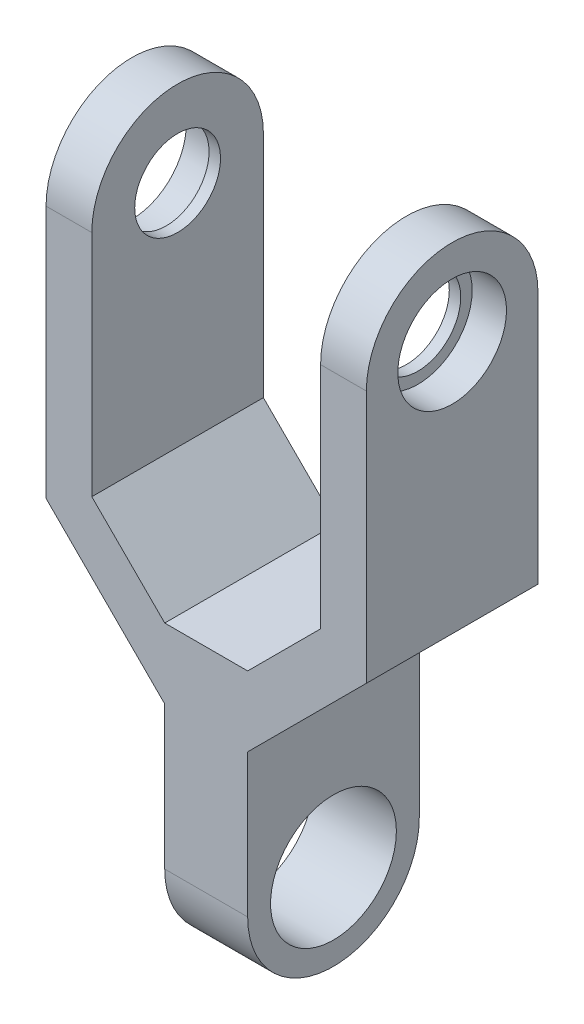
ISO-10303-21;
HEADER;
FILE_DESCRIPTION(('STEP AP214'),'2;1');
FILE_NAME('part.step','',(''),(''),'','','');
FILE_SCHEMA(('AUTOMOTIVE_DESIGN { 1 0 10303 214 1 1 1 1 }'));
ENDSEC;
DATA;
#1=APPLICATION_CONTEXT('core data for automotive mechanical design processes');
#2=APPLICATION_PROTOCOL_DEFINITION('international standard','automotive_design',2000,#1);
#3=PRODUCT_CONTEXT('',#1,'mechanical');
#4=PRODUCT('Part','Part','',(#3));
#5=PRODUCT_RELATED_PRODUCT_CATEGORY('part','',(#4));
#6=PRODUCT_DEFINITION_FORMATION('','',#4);
#7=PRODUCT_DEFINITION_CONTEXT('part definition',#1,'design');
#8=PRODUCT_DEFINITION('design','',#6,#7);
#9=PRODUCT_DEFINITION_SHAPE('','',#8);
#10=(LENGTH_UNIT() NAMED_UNIT(*) SI_UNIT(.MILLI.,.METRE.));
#11=(NAMED_UNIT(*) PLANE_ANGLE_UNIT() SI_UNIT($,.RADIAN.));
#12=(NAMED_UNIT(*) SI_UNIT($,.STERADIAN.) SOLID_ANGLE_UNIT());
#13=UNCERTAINTY_MEASURE_WITH_UNIT(LENGTH_MEASURE(1.E-05),#10,'distance_accuracy_value','');
#14=(GEOMETRIC_REPRESENTATION_CONTEXT(3) GLOBAL_UNCERTAINTY_ASSIGNED_CONTEXT((#13)) GLOBAL_UNIT_ASSIGNED_CONTEXT((#10,
#11,#12)) REPRESENTATION_CONTEXT('',''));
#15=CARTESIAN_POINT('',(0.,0.,0.));
#16=DIRECTION('',(0.,0.,1.));
#17=DIRECTION('',(1.,0.,0.));
#18=AXIS2_PLACEMENT_3D('',#15,#16,#17);
#19=CARTESIAN_POINT('',(41.25,90.,15.));
#20=DIRECTION('',(-1.,0.,0.));
#21=DIRECTION('',(0.,-1.,0.));
#22=AXIS2_PLACEMENT_3D('',#19,#20,#21);
#23=CYLINDRICAL_SURFACE('',#22,7.5);
#24=CARTESIAN_POINT('',(27.25,90.,15.));
#25=DIRECTION('',(1.,0.,0.));
#26=DIRECTION('',(0.,1.,0.));
#27=AXIS2_PLACEMENT_3D('',#24,#25,#26);
#28=CIRCLE('',#27,7.5);
#29=CARTESIAN_POINT('',(27.25,97.5,15.));
#30=VERTEX_POINT('',#29);
#31=EDGE_CURVE('E148',#30,#30,#28,.T.);
#32=ORIENTED_EDGE('',*,*,#31,.F.);
#33=EDGE_LOOP('',(#32));
#34=FACE_BOUND('',#33,.T.);
#35=CARTESIAN_POINT('',(29.25,90.,15.));
#36=DIRECTION('',(1.,0.,0.));
#37=DIRECTION('',(0.,0.,-1.));
#38=AXIS2_PLACEMENT_3D('',#35,#36,#37);
#39=CIRCLE('',#38,7.5);
#40=CARTESIAN_POINT('',(29.25,90.,7.5));
#41=VERTEX_POINT('',#40);
#42=EDGE_CURVE('E41',#41,#41,#39,.F.);
#43=ORIENTED_EDGE('',*,*,#42,.F.);
#44=EDGE_LOOP('',(#43));
#45=FACE_BOUND('',#44,.T.);
#46=ADVANCED_FACE('F37',(#34,#45),#23,.F.);
#47=CARTESIAN_POINT('',(-12.75,90.,15.));
#48=DIRECTION('',(-1.,0.,0.));
#49=DIRECTION('',(0.,0.,1.));
#50=AXIS2_PLACEMENT_3D('',#47,#48,#49);
#51=CIRCLE('',#50,7.5);
#52=CARTESIAN_POINT('',(-12.75,90.,22.5));
#53=VERTEX_POINT('',#52);
#54=EDGE_CURVE('E153',#53,#53,#51,.T.);
#55=ORIENTED_EDGE('',*,*,#54,.F.);
#56=EDGE_LOOP('',(#55));
#57=FACE_BOUND('',#56,.T.);
#58=CARTESIAN_POINT('',(-14.75,90.,15.));
#59=DIRECTION('',(-1.,0.,0.));
#60=DIRECTION('',(0.,-1.,0.));
#61=AXIS2_PLACEMENT_3D('',#58,#59,#60);
#62=CIRCLE('',#61,7.5);
#63=CARTESIAN_POINT('',(-14.75,82.5,15.));
#64=VERTEX_POINT('',#63);
#65=EDGE_CURVE('E243',#64,#64,#62,.F.);
#66=ORIENTED_EDGE('',*,*,#65,.F.);
#67=EDGE_LOOP('',(#66));
#68=FACE_BOUND('',#67,.T.);
#69=ADVANCED_FACE('F271',(#57,#68),#23,.F.);
#70=CARTESIAN_POINT('',(0.,25.,30.));
#71=DIRECTION('',(1.,0.,0.));
#72=DIRECTION('',(0.,1.,0.));
#73=AXIS2_PLACEMENT_3D('',#70,#71,#72);
#74=PLANE('',#73);
#75=CARTESIAN_POINT('',(0.,0.,15.));
#76=DIRECTION('',(1.,0.,0.));
#77=DIRECTION('',(0.,1.,0.));
#78=AXIS2_PLACEMENT_3D('',#75,#76,#77);
#79=CIRCLE('',#78,11.);
#80=CARTESIAN_POINT('',(0.,11.,15.));
#81=VERTEX_POINT('',#80);
#82=EDGE_CURVE('E164',#81,#81,#79,.T.);
#83=ORIENTED_EDGE('',*,*,#82,.T.);
#84=EDGE_LOOP('',(#83));
#85=FACE_BOUND('',#84,.T.);
#86=DIRECTION('',(0.,-1.,0.));
#87=VECTOR('',#86,1.);
#88=CARTESIAN_POINT('',(0.,25.,0.));
#89=LINE('',#88,#87);
#90=CARTESIAN_POINT('',(0.,25.,0.));
#91=VERTEX_POINT('',#90);
#92=CARTESIAN_POINT('',(0.,0.,0.));
#93=VERTEX_POINT('',#92);
#94=EDGE_CURVE('E192',#91,#93,#89,.T.);
#95=ORIENTED_EDGE('',*,*,#94,.T.);
#96=CARTESIAN_POINT('',(0.,0.,15.));
#97=DIRECTION('',(1.,0.,0.));
#98=DIRECTION('',(0.,1.,0.));
#99=AXIS2_PLACEMENT_3D('',#96,#97,#98);
#100=CIRCLE('',#99,15.);
#101=CARTESIAN_POINT('',(0.,0.,30.));
#102=VERTEX_POINT('',#101);
#103=EDGE_CURVE('E168',#93,#102,#100,.F.);
#104=ORIENTED_EDGE('',*,*,#103,.T.);
#105=DIRECTION('',(0.,-1.,0.));
#106=VECTOR('',#105,1.);
#107=CARTESIAN_POINT('',(0.,25.,30.));
#108=LINE('',#107,#106);
#109=CARTESIAN_POINT('',(0.,25.,30.));
#110=VERTEX_POINT('',#109);
#111=EDGE_CURVE('E99',#110,#102,#108,.T.);
#112=ORIENTED_EDGE('',*,*,#111,.F.);
#113=DIRECTION('',(0.,0.,-1.));
#114=VECTOR('',#113,1.);
#115=CARTESIAN_POINT('',(0.,25.,30.));
#116=LINE('',#115,#114);
#117=EDGE_CURVE('E210',#110,#91,#116,.T.);
#118=ORIENTED_EDGE('',*,*,#117,.T.);
#119=EDGE_LOOP('',(#95,#104,#112,#118));
#120=FACE_BOUND('',#119,.T.);
#121=ADVANCED_FACE('F39',(#85,#120),#74,.F.);
#122=CARTESIAN_POINT('',(14.5,0.,30.));
#123=DIRECTION('',(-1.,0.,0.));
#124=DIRECTION('',(0.,-1.,0.));
#125=AXIS2_PLACEMENT_3D('',#122,#123,#124);
#126=PLANE('',#125);
#127=CARTESIAN_POINT('',(14.5,0.,15.));
#128=DIRECTION('',(1.,0.,0.));
#129=DIRECTION('',(0.,0.,-1.));
#130=AXIS2_PLACEMENT_3D('',#127,#128,#129);
#131=CIRCLE('',#130,11.);
#132=CARTESIAN_POINT('',(14.5,0.,4.));
#133=VERTEX_POINT('',#132);
#134=EDGE_CURVE('E159',#133,#133,#131,.T.);
#135=ORIENTED_EDGE('',*,*,#134,.F.);
#136=EDGE_LOOP('',(#135));
#137=FACE_BOUND('',#136,.T.);
#138=DIRECTION('',(0.,1.,0.));
#139=VECTOR('',#138,1.);
#140=CARTESIAN_POINT('',(14.5,0.,0.));
#141=LINE('',#140,#139);
#142=CARTESIAN_POINT('',(14.5,0.,0.));
#143=VERTEX_POINT('',#142);
#144=CARTESIAN_POINT('',(14.5,25.,0.));
#145=VERTEX_POINT('',#144);
#146=EDGE_CURVE('E216',#143,#145,#141,.T.);
#147=ORIENTED_EDGE('',*,*,#146,.T.);
#148=DIRECTION('',(0.,0.,-1.));
#149=VECTOR('',#148,1.);
#150=CARTESIAN_POINT('',(14.5,25.,30.));
#151=LINE('',#150,#149);
#152=CARTESIAN_POINT('',(14.5,25.,30.));
#153=VERTEX_POINT('',#152);
#154=EDGE_CURVE('E11',#153,#145,#151,.T.);
#155=ORIENTED_EDGE('',*,*,#154,.F.);
#156=DIRECTION('',(0.,1.,0.));
#157=VECTOR('',#156,1.);
#158=CARTESIAN_POINT('',(14.5,0.,30.));
#159=LINE('',#158,#157);
#160=CARTESIAN_POINT('',(14.5,0.,30.));
#161=VERTEX_POINT('',#160);
#162=EDGE_CURVE('E197',#161,#153,#159,.T.);
#163=ORIENTED_EDGE('',*,*,#162,.F.);
#164=CARTESIAN_POINT('',(14.5,0.,15.));
#165=DIRECTION('',(1.,0.,0.));
#166=DIRECTION('',(0.,0.,-1.));
#167=AXIS2_PLACEMENT_3D('',#164,#165,#166);
#168=CIRCLE('',#167,15.);
#169=EDGE_CURVE('E167',#161,#143,#168,.T.);
#170=ORIENTED_EDGE('',*,*,#169,.T.);
#171=EDGE_LOOP('',(#147,#155,#163,#170));
#172=FACE_BOUND('',#171,.T.);
#173=ADVANCED_FACE('F335',(#137,#172),#126,.F.);
#174=CARTESIAN_POINT('',(14.5,25.,30.));
#175=DIRECTION('',(-0.707106781186546,0.707106781186549,0.));
#176=DIRECTION('',(-0.707106781186549,-0.707106781186546,0.));
#177=AXIS2_PLACEMENT_3D('',#174,#175,#176);
#178=PLANE('',#177);
#179=DIRECTION('',(0.707106781186549,0.707106781186546,0.));
#180=VECTOR('',#179,1.);
#181=CARTESIAN_POINT('',(14.5,25.,0.));
#182=LINE('',#181,#180);
#183=CARTESIAN_POINT('',(35.25,45.7499999999999,0.));
#184=VERTEX_POINT('',#183);
#185=EDGE_CURVE('E218',#145,#184,#182,.T.);
#186=ORIENTED_EDGE('',*,*,#185,.T.);
#187=DIRECTION('',(0.,0.,-1.));
#188=VECTOR('',#187,1.);
#189=CARTESIAN_POINT('',(35.25,45.7499999999999,30.));
#190=LINE('',#189,#188);
#191=CARTESIAN_POINT('',(35.25,45.7499999999999,30.));
#192=VERTEX_POINT('',#191);
#193=EDGE_CURVE('E46',#192,#184,#190,.T.);
#194=ORIENTED_EDGE('',*,*,#193,.F.);
#195=DIRECTION('',(0.707106781186549,0.707106781186546,0.));
#196=VECTOR('',#195,1.);
#197=CARTESIAN_POINT('',(14.5,25.,30.));
#198=LINE('',#197,#196);
#199=EDGE_CURVE('E199',#153,#192,#198,.T.);
#200=ORIENTED_EDGE('',*,*,#199,.F.);
#201=ORIENTED_EDGE('',*,*,#154,.T.);
#202=EDGE_LOOP('',(#186,#194,#200,#201));
#203=FACE_BOUND('',#202,.T.);
#204=ADVANCED_FACE('F332',(#203),#178,.F.);
#205=CARTESIAN_POINT('',(35.25,45.7499999999999,30.));
#206=DIRECTION('',(-1.,0.,0.));
#207=DIRECTION('',(0.,0.,1.));
#208=AXIS2_PLACEMENT_3D('',#205,#206,#207);
#209=PLANE('',#208);
#210=CARTESIAN_POINT('',(35.25,90.,15.));
#211=DIRECTION('',(1.,0.,0.));
#212=DIRECTION('',(0.,0.,-1.));
#213=AXIS2_PLACEMENT_3D('',#210,#211,#212);
#214=CIRCLE('',#213,9.49999999999999);
#215=CARTESIAN_POINT('',(35.25,90.,5.50000000000001));
#216=VERTEX_POINT('',#215);
#217=EDGE_CURVE('E258',#216,#216,#214,.T.);
#218=ORIENTED_EDGE('',*,*,#217,.F.);
#219=EDGE_LOOP('',(#218));
#220=FACE_BOUND('',#219,.T.);
#221=DIRECTION('',(0.,1.,0.));
#222=VECTOR('',#221,1.);
#223=CARTESIAN_POINT('',(35.25,45.7499999999999,0.));
#224=LINE('',#223,#222);
#225=CARTESIAN_POINT('',(35.25,90.,0.));
#226=VERTEX_POINT('',#225);
#227=EDGE_CURVE('E220',#184,#226,#224,.T.);
#228=ORIENTED_EDGE('',*,*,#227,.T.);
#229=CARTESIAN_POINT('',(35.25,90.,15.));
#230=DIRECTION('',(1.,0.,0.));
#231=DIRECTION('',(0.,0.,1.));
#232=AXIS2_PLACEMENT_3D('',#229,#230,#231);
#233=CIRCLE('',#232,15.);
#234=CARTESIAN_POINT('',(35.25,90.,30.));
#235=VERTEX_POINT('',#234);
#236=EDGE_CURVE('E150',#226,#235,#233,.T.);
#237=ORIENTED_EDGE('',*,*,#236,.T.);
#238=DIRECTION('',(0.,1.,0.));
#239=VECTOR('',#238,1.);
#240=CARTESIAN_POINT('',(35.25,45.7499999999999,30.));
#241=LINE('',#240,#239);
#242=EDGE_CURVE('E201',#192,#235,#241,.T.);
#243=ORIENTED_EDGE('',*,*,#242,.F.);
#244=ORIENTED_EDGE('',*,*,#193,.T.);
#245=EDGE_LOOP('',(#228,#237,#243,#244));
#246=FACE_BOUND('',#245,.T.);
#247=ADVANCED_FACE('F328',(#220,#246),#209,.F.);
#248=CARTESIAN_POINT('',(27.25,90.,30.));
#249=DIRECTION('',(1.,0.,0.));
#250=DIRECTION('',(0.,1.,0.));
#251=AXIS2_PLACEMENT_3D('',#248,#249,#250);
#252=PLANE('',#251);
#253=ORIENTED_EDGE('',*,*,#31,.T.);
#254=EDGE_LOOP('',(#253));
#255=FACE_BOUND('',#254,.T.);
#256=DIRECTION('',(0.,-1.,0.));
#257=VECTOR('',#256,1.);
#258=CARTESIAN_POINT('',(27.25,90.,0.));
#259=LINE('',#258,#257);
#260=CARTESIAN_POINT('',(27.25,90.,0.));
#261=VERTEX_POINT('',#260);
#262=CARTESIAN_POINT('',(27.25,50.,0.));
#263=VERTEX_POINT('',#262);
#264=EDGE_CURVE('E225',#261,#263,#259,.T.);
#265=ORIENTED_EDGE('',*,*,#264,.T.);
#266=DIRECTION('',(0.,0.,-1.));
#267=VECTOR('',#266,1.);
#268=CARTESIAN_POINT('',(27.25,50.,30.));
#269=LINE('',#268,#267);
#270=CARTESIAN_POINT('',(27.25,50.,30.));
#271=VERTEX_POINT('',#270);
#272=EDGE_CURVE('E239',#271,#263,#269,.T.);
#273=ORIENTED_EDGE('',*,*,#272,.F.);
#274=DIRECTION('',(0.,-1.,0.));
#275=VECTOR('',#274,1.);
#276=CARTESIAN_POINT('',(27.25,90.,30.));
#277=LINE('',#276,#275);
#278=CARTESIAN_POINT('',(27.25,90.,30.));
#279=VERTEX_POINT('',#278);
#280=EDGE_CURVE('E205',#279,#271,#277,.T.);
#281=ORIENTED_EDGE('',*,*,#280,.F.);
#282=CARTESIAN_POINT('',(27.25,90.,15.));
#283=DIRECTION('',(1.,0.,0.));
#284=DIRECTION('',(0.,1.,0.));
#285=AXIS2_PLACEMENT_3D('',#282,#283,#284);
#286=CIRCLE('',#285,15.);
#287=EDGE_CURVE('E156',#279,#261,#286,.F.);
#288=ORIENTED_EDGE('',*,*,#287,.T.);
#289=EDGE_LOOP('',(#265,#273,#281,#288));
#290=FACE_BOUND('',#289,.T.);
#291=ADVANCED_FACE('F324',(#255,#290),#252,.F.);
#292=CARTESIAN_POINT('',(-12.75,50.,30.));
#293=DIRECTION('',(-1.,0.,0.));
#294=DIRECTION('',(0.,0.,1.));
#295=AXIS2_PLACEMENT_3D('',#292,#293,#294);
#296=PLANE('',#295);
#297=ORIENTED_EDGE('',*,*,#54,.T.);
#298=EDGE_LOOP('',(#297));
#299=FACE_BOUND('',#298,.T.);
#300=DIRECTION('',(0.,1.,0.));
#301=VECTOR('',#300,1.);
#302=CARTESIAN_POINT('',(-12.75,50.,0.));
#303=LINE('',#302,#301);
#304=CARTESIAN_POINT('',(-12.75,50.,0.));
#305=VERTEX_POINT('',#304);
#306=CARTESIAN_POINT('',(-12.75,90.,0.));
#307=VERTEX_POINT('',#306);
#308=EDGE_CURVE('E228',#305,#307,#303,.T.);
#309=ORIENTED_EDGE('',*,*,#308,.T.);
#310=CARTESIAN_POINT('',(-12.75,90.,15.));
#311=DIRECTION('',(-1.,0.,0.));
#312=DIRECTION('',(0.,0.,1.));
#313=AXIS2_PLACEMENT_3D('',#310,#311,#312);
#314=CIRCLE('',#313,15.);
#315=CARTESIAN_POINT('',(-12.75,90.,30.));
#316=VERTEX_POINT('',#315);
#317=EDGE_CURVE('E147',#307,#316,#314,.F.);
#318=ORIENTED_EDGE('',*,*,#317,.T.);
#319=DIRECTION('',(0.,1.,0.));
#320=VECTOR('',#319,1.);
#321=CARTESIAN_POINT('',(-12.75,50.,30.));
#322=LINE('',#321,#320);
#323=CARTESIAN_POINT('',(-12.75,50.,30.));
#324=VERTEX_POINT('',#323);
#325=EDGE_CURVE('E130',#324,#316,#322,.T.);
#326=ORIENTED_EDGE('',*,*,#325,.F.);
#327=DIRECTION('',(0.,0.,-1.));
#328=VECTOR('',#327,1.);
#329=CARTESIAN_POINT('',(-12.75,50.,30.));
#330=LINE('',#329,#328);
#331=EDGE_CURVE('E236',#324,#305,#330,.T.);
#332=ORIENTED_EDGE('',*,*,#331,.T.);
#333=EDGE_LOOP('',(#309,#318,#326,#332));
#334=FACE_BOUND('',#333,.T.);
#335=ADVANCED_FACE('F320',(#299,#334),#296,.F.);
#336=CARTESIAN_POINT('',(-20.75,90.,30.));
#337=DIRECTION('',(1.,0.,0.));
#338=DIRECTION('',(0.,1.,0.));
#339=AXIS2_PLACEMENT_3D('',#336,#337,#338);
#340=PLANE('',#339);
#341=CARTESIAN_POINT('',(-20.75,90.,15.));
#342=DIRECTION('',(-1.,0.,0.));
#343=DIRECTION('',(0.,-1.,0.));
#344=AXIS2_PLACEMENT_3D('',#341,#342,#343);
#345=CIRCLE('',#344,9.49999999999999);
#346=CARTESIAN_POINT('',(-20.75,80.5,15.));
#347=VERTEX_POINT('',#346);
#348=EDGE_CURVE('E251',#347,#347,#345,.T.);
#349=ORIENTED_EDGE('',*,*,#348,.F.);
#350=EDGE_LOOP('',(#349));
#351=FACE_BOUND('',#350,.T.);
#352=DIRECTION('',(0.,-1.,0.));
#353=VECTOR('',#352,1.);
#354=CARTESIAN_POINT('',(-20.75,90.,0.));
#355=LINE('',#354,#353);
#356=CARTESIAN_POINT('',(-20.75,90.,0.));
#357=VERTEX_POINT('',#356);
#358=CARTESIAN_POINT('',(-20.75,45.7500000000002,0.));
#359=VERTEX_POINT('',#358);
#360=EDGE_CURVE('E231',#357,#359,#355,.T.);
#361=ORIENTED_EDGE('',*,*,#360,.T.);
#362=DIRECTION('',(0.,0.,-1.));
#363=VECTOR('',#362,1.);
#364=CARTESIAN_POINT('',(-20.75,45.7500000000002,30.));
#365=LINE('',#364,#363);
#366=CARTESIAN_POINT('',(-20.75,45.7500000000002,30.));
#367=VERTEX_POINT('',#366);
#368=EDGE_CURVE('E141',#367,#359,#365,.T.);
#369=ORIENTED_EDGE('',*,*,#368,.F.);
#370=DIRECTION('',(0.,-1.,0.));
#371=VECTOR('',#370,1.);
#372=CARTESIAN_POINT('',(-20.75,90.,30.));
#373=LINE('',#372,#371);
#374=CARTESIAN_POINT('',(-20.75,90.,30.));
#375=VERTEX_POINT('',#374);
#376=EDGE_CURVE('E126',#375,#367,#373,.T.);
#377=ORIENTED_EDGE('',*,*,#376,.F.);
#378=CARTESIAN_POINT('',(-20.75,90.,15.));
#379=DIRECTION('',(-1.,0.,0.));
#380=DIRECTION('',(0.,1.,0.));
#381=AXIS2_PLACEMENT_3D('',#378,#379,#380);
#382=CIRCLE('',#381,15.);
#383=EDGE_CURVE('E140',#375,#357,#382,.T.);
#384=ORIENTED_EDGE('',*,*,#383,.T.);
#385=EDGE_LOOP('',(#361,#369,#377,#384));
#386=FACE_BOUND('',#385,.T.);
#387=ADVANCED_FACE('F138',(#351,#386),#340,.F.);
#388=CARTESIAN_POINT('',(0.,25.,30.));
#389=DIRECTION('',(0.707106781186551,0.707106781186544,0.));
#390=DIRECTION('',(-0.707106781186544,0.707106781186551,0.));
#391=AXIS2_PLACEMENT_3D('',#388,#389,#390);
#392=PLANE('',#391);
#393=DIRECTION('',(0.707106781186544,-0.707106781186551,0.));
#394=VECTOR('',#393,1.);
#395=CARTESIAN_POINT('',(0.,25.,0.));
#396=LINE('',#395,#394);
#397=EDGE_CURVE('E93',#359,#91,#396,.T.);
#398=ORIENTED_EDGE('',*,*,#397,.T.);
#399=ORIENTED_EDGE('',*,*,#117,.F.);
#400=DIRECTION('',(0.707106781186544,-0.707106781186551,0.));
#401=VECTOR('',#400,1.);
#402=CARTESIAN_POINT('',(0.,25.,30.));
#403=LINE('',#402,#401);
#404=EDGE_CURVE('E63',#367,#110,#403,.T.);
#405=ORIENTED_EDGE('',*,*,#404,.F.);
#406=ORIENTED_EDGE('',*,*,#368,.T.);
#407=EDGE_LOOP('',(#398,#399,#405,#406));
#408=FACE_BOUND('',#407,.T.);
#409=ADVANCED_FACE('F312',(#408),#392,.F.);
#410=CARTESIAN_POINT('',(0.,0.,30.));
#411=DIRECTION('',(0.,0.,1.));
#412=DIRECTION('',(1.,0.,0.));
#413=AXIS2_PLACEMENT_3D('',#410,#411,#412);
#414=PLANE('',#413);
#415=DIRECTION('',(0.707106781186547,0.707106781186547,0.));
#416=VECTOR('',#415,1.);
#417=CARTESIAN_POINT('',(14.5,37.25,30.));
#418=LINE('',#417,#416);
#419=CARTESIAN_POINT('',(14.5,37.25,30.));
#420=VERTEX_POINT('',#419);
#421=EDGE_CURVE('E176',#420,#271,#418,.T.);
#422=ORIENTED_EDGE('',*,*,#421,.F.);
#423=DIRECTION('',(1.,0.,0.));
#424=VECTOR('',#423,1.);
#425=CARTESIAN_POINT('',(0.,37.25,30.));
#426=LINE('',#425,#424);
#427=CARTESIAN_POINT('',(0.,37.25,30.));
#428=VERTEX_POINT('',#427);
#429=EDGE_CURVE('E184',#428,#420,#426,.T.);
#430=ORIENTED_EDGE('',*,*,#429,.F.);
#431=DIRECTION('',(0.707106781186547,-0.707106781186548,0.));
#432=VECTOR('',#431,1.);
#433=CARTESIAN_POINT('',(-12.75,50.,30.));
#434=LINE('',#433,#432);
#435=EDGE_CURVE('E170',#324,#428,#434,.T.);
#436=ORIENTED_EDGE('',*,*,#435,.F.);
#437=ORIENTED_EDGE('',*,*,#325,.T.);
#438=DIRECTION('',(-1.,0.,0.));
#439=VECTOR('',#438,1.);
#440=CARTESIAN_POINT('',(-12.75,90.,30.));
#441=LINE('',#440,#439);
#442=EDGE_CURVE('E122',#316,#375,#441,.T.);
#443=ORIENTED_EDGE('',*,*,#442,.T.);
#444=ORIENTED_EDGE('',*,*,#376,.T.);
#445=ORIENTED_EDGE('',*,*,#404,.T.);
#446=ORIENTED_EDGE('',*,*,#111,.T.);
#447=DIRECTION('',(1.,0.,0.));
#448=VECTOR('',#447,1.);
#449=CARTESIAN_POINT('',(0.,0.,30.));
#450=LINE('',#449,#448);
#451=EDGE_CURVE('E195',#102,#161,#450,.T.);
#452=ORIENTED_EDGE('',*,*,#451,.T.);
#453=ORIENTED_EDGE('',*,*,#162,.T.);
#454=ORIENTED_EDGE('',*,*,#199,.T.);
#455=ORIENTED_EDGE('',*,*,#242,.T.);
#456=DIRECTION('',(-1.,0.,0.));
#457=VECTOR('',#456,1.);
#458=CARTESIAN_POINT('',(35.25,90.,30.));
#459=LINE('',#458,#457);
#460=EDGE_CURVE('E203',#235,#279,#459,.T.);
#461=ORIENTED_EDGE('',*,*,#460,.T.);
#462=ORIENTED_EDGE('',*,*,#280,.T.);
#463=EDGE_LOOP('',(#422,#430,#436,#437,#443,#444,#445,#446,#452,#453,#454,#455,#461,#462));
#464=FACE_BOUND('',#463,.T.);
#465=ADVANCED_FACE('F125',(#464),#414,.T.);
#466=CARTESIAN_POINT('',(0.,0.,0.));
#467=DIRECTION('',(0.,0.,1.));
#468=DIRECTION('',(1.,0.,0.));
#469=AXIS2_PLACEMENT_3D('',#466,#467,#468);
#470=PLANE('',#469);
#471=DIRECTION('',(1.,0.,0.));
#472=VECTOR('',#471,1.);
#473=CARTESIAN_POINT('',(0.,37.25,0.));
#474=LINE('',#473,#472);
#475=CARTESIAN_POINT('',(0.,37.25,0.));
#476=VERTEX_POINT('',#475);
#477=CARTESIAN_POINT('',(14.5,37.25,0.));
#478=VERTEX_POINT('',#477);
#479=EDGE_CURVE('E54',#476,#478,#474,.T.);
#480=ORIENTED_EDGE('',*,*,#479,.T.);
#481=DIRECTION('',(0.707106781186547,0.707106781186547,0.));
#482=VECTOR('',#481,1.);
#483=CARTESIAN_POINT('',(14.5,37.25,0.));
#484=LINE('',#483,#482);
#485=EDGE_CURVE('E178',#478,#263,#484,.T.);
#486=ORIENTED_EDGE('',*,*,#485,.T.);
#487=ORIENTED_EDGE('',*,*,#264,.F.);
#488=DIRECTION('',(-1.,0.,0.));
#489=VECTOR('',#488,1.);
#490=CARTESIAN_POINT('',(35.25,90.,0.));
#491=LINE('',#490,#489);
#492=EDGE_CURVE('E222',#226,#261,#491,.T.);
#493=ORIENTED_EDGE('',*,*,#492,.F.);
#494=ORIENTED_EDGE('',*,*,#227,.F.);
#495=ORIENTED_EDGE('',*,*,#185,.F.);
#496=ORIENTED_EDGE('',*,*,#146,.F.);
#497=DIRECTION('',(1.,0.,0.));
#498=VECTOR('',#497,1.);
#499=CARTESIAN_POINT('',(0.,0.,0.));
#500=LINE('',#499,#498);
#501=EDGE_CURVE('E213',#93,#143,#500,.T.);
#502=ORIENTED_EDGE('',*,*,#501,.F.);
#503=ORIENTED_EDGE('',*,*,#94,.F.);
#504=ORIENTED_EDGE('',*,*,#397,.F.);
#505=ORIENTED_EDGE('',*,*,#360,.F.);
#506=DIRECTION('',(-1.,0.,0.));
#507=VECTOR('',#506,1.);
#508=CARTESIAN_POINT('',(-12.75,90.,0.));
#509=LINE('',#508,#507);
#510=EDGE_CURVE('E146',#307,#357,#509,.T.);
#511=ORIENTED_EDGE('',*,*,#510,.F.);
#512=ORIENTED_EDGE('',*,*,#308,.F.);
#513=DIRECTION('',(0.707106781186547,-0.707106781186548,0.));
#514=VECTOR('',#513,1.);
#515=CARTESIAN_POINT('',(-12.75,50.,0.));
#516=LINE('',#515,#514);
#517=EDGE_CURVE('E173',#305,#476,#516,.T.);
#518=ORIENTED_EDGE('',*,*,#517,.T.);
#519=EDGE_LOOP('',(#480,#486,#487,#493,#494,#495,#496,#502,#503,#504,#505,#511,#512,#518));
#520=FACE_BOUND('',#519,.T.);
#521=ADVANCED_FACE('F303',(#520),#470,.F.);
#522=CARTESIAN_POINT('',(14.5,37.25,0.));
#523=DIRECTION('',(0.707106781186547,-0.707106781186547,0.));
#524=DIRECTION('',(0.707106781186548,0.707106781186547,0.));
#525=AXIS2_PLACEMENT_3D('',#522,#523,#524);
#526=PLANE('',#525);
#527=ORIENTED_EDGE('',*,*,#421,.T.);
#528=ORIENTED_EDGE('',*,*,#272,.T.);
#529=ORIENTED_EDGE('',*,*,#485,.F.);
#530=DIRECTION('',(0.,0.,1.));
#531=VECTOR('',#530,1.);
#532=CARTESIAN_POINT('',(14.5,37.25,0.));
#533=LINE('',#532,#531);
#534=EDGE_CURVE('E189',#478,#420,#533,.T.);
#535=ORIENTED_EDGE('',*,*,#534,.T.);
#536=EDGE_LOOP('',(#527,#528,#529,#535));
#537=FACE_BOUND('',#536,.T.);
#538=ADVANCED_FACE('F299',(#537),#526,.F.);
#539=CARTESIAN_POINT('',(0.,37.25,0.));
#540=DIRECTION('',(0.,-1.,0.));
#541=DIRECTION('',(0.,0.,-1.));
#542=AXIS2_PLACEMENT_3D('',#539,#540,#541);
#543=PLANE('',#542);
#544=ORIENTED_EDGE('',*,*,#429,.T.);
#545=ORIENTED_EDGE('',*,*,#534,.F.);
#546=ORIENTED_EDGE('',*,*,#479,.F.);
#547=DIRECTION('',(0.,0.,1.));
#548=VECTOR('',#547,1.);
#549=CARTESIAN_POINT('',(0.,37.25,0.));
#550=LINE('',#549,#548);
#551=EDGE_CURVE('E181',#476,#428,#550,.T.);
#552=ORIENTED_EDGE('',*,*,#551,.T.);
#553=EDGE_LOOP('',(#544,#545,#546,#552));
#554=FACE_BOUND('',#553,.T.);
#555=ADVANCED_FACE('F302',(#554),#543,.F.);
#556=CARTESIAN_POINT('',(-12.75,50.,0.));
#557=DIRECTION('',(-0.707106781186548,-0.707106781186547,0.));
#558=DIRECTION('',(0.707106781186547,-0.707106781186548,0.));
#559=AXIS2_PLACEMENT_3D('',#556,#557,#558);
#560=PLANE('',#559);
#561=ORIENTED_EDGE('',*,*,#435,.T.);
#562=ORIENTED_EDGE('',*,*,#551,.F.);
#563=ORIENTED_EDGE('',*,*,#517,.F.);
#564=ORIENTED_EDGE('',*,*,#331,.F.);
#565=EDGE_LOOP('',(#561,#562,#563,#564));
#566=FACE_BOUND('',#565,.T.);
#567=ADVANCED_FACE('F297',(#566),#560,.F.);
#568=CARTESIAN_POINT('',(-33.5410196624969,0.,15.));
#569=DIRECTION('',(1.,0.,0.));
#570=DIRECTION('',(0.,0.,-1.));
#571=AXIS2_PLACEMENT_3D('',#568,#569,#570);
#572=CYLINDRICAL_SURFACE('',#571,15.);
#573=ORIENTED_EDGE('',*,*,#103,.F.);
#574=ORIENTED_EDGE('',*,*,#501,.T.);
#575=ORIENTED_EDGE('',*,*,#169,.F.);
#576=ORIENTED_EDGE('',*,*,#451,.F.);
#577=EDGE_LOOP('',(#573,#574,#575,#576));
#578=FACE_BOUND('',#577,.T.);
#579=ADVANCED_FACE('F293',(#578),#572,.T.);
#580=CARTESIAN_POINT('',(-5.5,0.,15.));
#581=DIRECTION('',(1.,0.,0.));
#582=DIRECTION('',(0.,0.,-1.));
#583=AXIS2_PLACEMENT_3D('',#580,#581,#582);
#584=CYLINDRICAL_SURFACE('',#583,11.);
#585=ORIENTED_EDGE('',*,*,#134,.T.);
#586=EDGE_LOOP('',(#585));
#587=FACE_BOUND('',#586,.T.);
#588=ORIENTED_EDGE('',*,*,#82,.F.);
#589=EDGE_LOOP('',(#588));
#590=FACE_BOUND('',#589,.T.);
#591=ADVANCED_FACE('F289',(#587,#590),#584,.F.);
#592=CARTESIAN_POINT('',(-6.29101966249684,90.,15.));
#593=DIRECTION('',(1.,0.,0.));
#594=DIRECTION('',(0.,0.,-1.));
#595=AXIS2_PLACEMENT_3D('',#592,#593,#594);
#596=CYLINDRICAL_SURFACE('',#595,15.);
#597=ORIENTED_EDGE('',*,*,#287,.F.);
#598=ORIENTED_EDGE('',*,*,#460,.F.);
#599=ORIENTED_EDGE('',*,*,#236,.F.);
#600=ORIENTED_EDGE('',*,*,#492,.T.);
#601=EDGE_LOOP('',(#597,#598,#599,#600));
#602=FACE_BOUND('',#601,.T.);
#603=ADVANCED_FACE('F286',(#602),#596,.T.);
#604=CARTESIAN_POINT('',(20.7910196624968,90.,15.));
#605=DIRECTION('',(-1.,0.,0.));
#606=DIRECTION('',(0.,-1.,0.));
#607=AXIS2_PLACEMENT_3D('',#604,#605,#606);
#608=CYLINDRICAL_SURFACE('',#607,15.);
#609=ORIENTED_EDGE('',*,*,#317,.F.);
#610=ORIENTED_EDGE('',*,*,#510,.T.);
#611=ORIENTED_EDGE('',*,*,#383,.F.);
#612=ORIENTED_EDGE('',*,*,#442,.F.);
#613=EDGE_LOOP('',(#609,#610,#611,#612));
#614=FACE_BOUND('',#613,.T.);
#615=ADVANCED_FACE('F144',(#614),#608,.T.);
#616=CARTESIAN_POINT('',(-14.75,90.,15.));
#617=DIRECTION('',(-1.,0.,0.));
#618=DIRECTION('',(0.,-1.,0.));
#619=AXIS2_PLACEMENT_3D('',#616,#617,#618);
#620=PLANE('',#619);
#621=CARTESIAN_POINT('',(-14.75,90.,15.));
#622=DIRECTION('',(-1.,0.,0.));
#623=DIRECTION('',(0.,-1.,0.));
#624=AXIS2_PLACEMENT_3D('',#621,#622,#623);
#625=CIRCLE('',#624,9.49999999999999);
#626=CARTESIAN_POINT('',(-14.75,80.5,15.));
#627=VERTEX_POINT('',#626);
#628=EDGE_CURVE('E245',#627,#627,#625,.T.);
#629=ORIENTED_EDGE('',*,*,#628,.T.);
#630=EDGE_LOOP('',(#629));
#631=FACE_BOUND('',#630,.T.);
#632=ORIENTED_EDGE('',*,*,#65,.T.);
#633=EDGE_LOOP('',(#632));
#634=FACE_BOUND('',#633,.T.);
#635=ADVANCED_FACE('F285',(#631,#634),#620,.T.);
#636=CARTESIAN_POINT('',(-14.75,90.,15.));
#637=DIRECTION('',(-1.,0.,0.));
#638=DIRECTION('',(0.,-1.,0.));
#639=AXIS2_PLACEMENT_3D('',#636,#637,#638);
#640=CYLINDRICAL_SURFACE('',#639,9.49999999999999);
#641=ORIENTED_EDGE('',*,*,#628,.F.);
#642=EDGE_LOOP('',(#641));
#643=FACE_BOUND('',#642,.T.);
#644=ORIENTED_EDGE('',*,*,#348,.T.);
#645=EDGE_LOOP('',(#644));
#646=FACE_BOUND('',#645,.T.);
#647=ADVANCED_FACE('F281',(#643,#646),#640,.F.);
#648=CARTESIAN_POINT('',(29.25,90.,15.));
#649=DIRECTION('',(1.,0.,0.));
#650=DIRECTION('',(0.,0.,-1.));
#651=AXIS2_PLACEMENT_3D('',#648,#649,#650);
#652=PLANE('',#651);
#653=CARTESIAN_POINT('',(29.25,90.,15.));
#654=DIRECTION('',(1.,0.,0.));
#655=DIRECTION('',(0.,0.,-1.));
#656=AXIS2_PLACEMENT_3D('',#653,#654,#655);
#657=CIRCLE('',#656,9.49999999999999);
#658=CARTESIAN_POINT('',(29.25,90.,5.50000000000001));
#659=VERTEX_POINT('',#658);
#660=EDGE_CURVE('E261',#659,#659,#657,.T.);
#661=ORIENTED_EDGE('',*,*,#660,.T.);
#662=EDGE_LOOP('',(#661));
#663=FACE_BOUND('',#662,.T.);
#664=ORIENTED_EDGE('',*,*,#42,.T.);
#665=EDGE_LOOP('',(#664));
#666=FACE_BOUND('',#665,.T.);
#667=ADVANCED_FACE('F268',(#663,#666),#652,.T.);
#668=CARTESIAN_POINT('',(29.25,90.,15.));
#669=DIRECTION('',(1.,0.,0.));
#670=DIRECTION('',(0.,0.,-1.));
#671=AXIS2_PLACEMENT_3D('',#668,#669,#670);
#672=CYLINDRICAL_SURFACE('',#671,9.49999999999999);
#673=ORIENTED_EDGE('',*,*,#660,.F.);
#674=EDGE_LOOP('',(#673));
#675=FACE_BOUND('',#674,.T.);
#676=ORIENTED_EDGE('',*,*,#217,.T.);
#677=EDGE_LOOP('',(#676));
#678=FACE_BOUND('',#677,.T.);
#679=ADVANCED_FACE('F447',(#675,#678),#672,.F.);
#680=CLOSED_SHELL('',(#46,#69,#121,#173,#204,#247,#291,#335,#387,#409,#465,#521,#538,#555,#567,
#579,#591,#603,#615,#635,#647,#667,#679));
#681=MANIFOLD_SOLID_BREP('B2',#680);
#682=ADVANCED_BREP_SHAPE_REPRESENTATION('',(#18,#681),#14);
#683=SHAPE_DEFINITION_REPRESENTATION(#9,#682);
ENDSEC;
END-ISO-10303-21;
